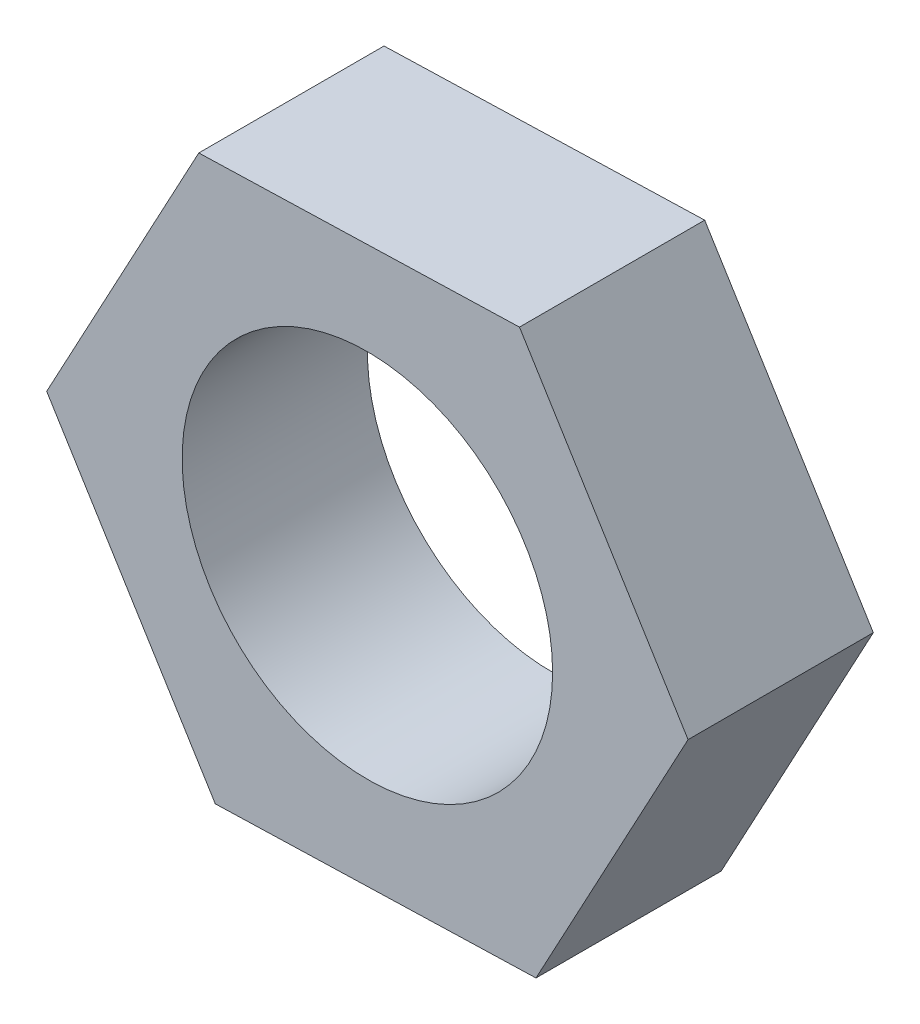
ISO-10303-21;
HEADER;
FILE_DESCRIPTION(('STEP AP214'),'2;1');
FILE_NAME('part.step','',(''),(''),'','','');
FILE_SCHEMA(('AUTOMOTIVE_DESIGN { 1 0 10303 214 1 1 1 1 }'));
ENDSEC;
DATA;
#1=APPLICATION_CONTEXT('core data for automotive mechanical design processes');
#2=APPLICATION_PROTOCOL_DEFINITION('international standard','automotive_design',2000,#1);
#3=PRODUCT_CONTEXT('',#1,'mechanical');
#4=PRODUCT('Part','Part','',(#3));
#5=PRODUCT_RELATED_PRODUCT_CATEGORY('part','',(#4));
#6=PRODUCT_DEFINITION_FORMATION('','',#4);
#7=PRODUCT_DEFINITION_CONTEXT('part definition',#1,'design');
#8=PRODUCT_DEFINITION('design','',#6,#7);
#9=PRODUCT_DEFINITION_SHAPE('','',#8);
#10=(LENGTH_UNIT() NAMED_UNIT(*) SI_UNIT(.MILLI.,.METRE.));
#11=(NAMED_UNIT(*) PLANE_ANGLE_UNIT() SI_UNIT($,.RADIAN.));
#12=(NAMED_UNIT(*) SI_UNIT($,.STERADIAN.) SOLID_ANGLE_UNIT());
#13=UNCERTAINTY_MEASURE_WITH_UNIT(LENGTH_MEASURE(1.E-05),#10,'distance_accuracy_value','');
#14=(GEOMETRIC_REPRESENTATION_CONTEXT(3) GLOBAL_UNCERTAINTY_ASSIGNED_CONTEXT((#13)) GLOBAL_UNIT_ASSIGNED_CONTEXT((#10,
#11,#12)) REPRESENTATION_CONTEXT('',''));
#15=CARTESIAN_POINT('',(0.,0.,0.));
#16=DIRECTION('',(0.,0.,1.));
#17=DIRECTION('',(1.,0.,0.));
#18=AXIS2_PLACEMENT_3D('',#15,#16,#17);
#19=CARTESIAN_POINT('',(0.,0.,5.));
#20=DIRECTION('',(0.,0.,1.));
#21=DIRECTION('',(1.,0.,0.));
#22=AXIS2_PLACEMENT_3D('',#19,#20,#21);
#23=PLANE('',#22);
#24=DIRECTION('',(0.999559119563031,0.0296911855334074,0.));
#25=VECTOR('',#24,1.);
#26=CARTESIAN_POINT('',(-4.1055340591294,-7.62526000142477,5.));
#27=LINE('',#26,#25);
#28=CARTESIAN_POINT('',(-4.1055340591294,-7.62526000142477,5.));
#29=VERTEX_POINT('',#28);
#30=CARTESIAN_POINT('',(4.55090184213052,-7.36812679202069,5.));
#31=VERTEX_POINT('',#30);
#32=EDGE_CURVE('E129',#29,#31,#27,.T.);
#33=ORIENTED_EDGE('',*,*,#32,.T.);
#34=DIRECTION('',(0.474066238841107,0.880489182892695,0.));
#35=VECTOR('',#34,1.);
#36=CARTESIAN_POINT('',(4.55090184213052,-7.36812679202069,5.));
#37=LINE('',#36,#35);
#38=CARTESIAN_POINT('',(8.65643590125991,0.257133209404077,5.));
#39=VERTEX_POINT('',#38);
#40=EDGE_CURVE('E87',#31,#39,#37,.T.);
#41=ORIENTED_EDGE('',*,*,#40,.T.);
#42=DIRECTION('',(-0.525492880721923,0.850797997359288,0.));
#43=VECTOR('',#42,1.);
#44=CARTESIAN_POINT('',(8.65643590125991,0.257133209404077,5.));
#45=LINE('',#44,#43);
#46=CARTESIAN_POINT('',(4.1055340591294,7.62526000142477,5.));
#47=VERTEX_POINT('',#46);
#48=EDGE_CURVE('E100',#39,#47,#45,.T.);
#49=ORIENTED_EDGE('',*,*,#48,.T.);
#50=DIRECTION('',(-0.999559119563031,-0.0296911855334073,0.));
#51=VECTOR('',#50,1.);
#52=CARTESIAN_POINT('',(4.1055340591294,7.62526000142477,5.));
#53=LINE('',#52,#51);
#54=CARTESIAN_POINT('',(-4.55090184213051,7.36812679202069,5.));
#55=VERTEX_POINT('',#54);
#56=EDGE_CURVE('E94',#47,#55,#53,.T.);
#57=ORIENTED_EDGE('',*,*,#56,.T.);
#58=DIRECTION('',(-0.474066238841108,-0.880489182892695,0.));
#59=VECTOR('',#58,1.);
#60=CARTESIAN_POINT('',(-4.55090184213051,7.36812679202069,5.));
#61=LINE('',#60,#59);
#62=CARTESIAN_POINT('',(-8.65643590125991,-0.257133209404078,5.));
#63=VERTEX_POINT('',#62);
#64=EDGE_CURVE('E98',#55,#63,#61,.T.);
#65=ORIENTED_EDGE('',*,*,#64,.T.);
#66=DIRECTION('',(0.525492880721923,-0.850797997359288,0.));
#67=VECTOR('',#66,1.);
#68=CARTESIAN_POINT('',(-8.65643590125991,-0.257133209404078,5.));
#69=LINE('',#68,#67);
#70=EDGE_CURVE('E50',#63,#29,#69,.T.);
#71=ORIENTED_EDGE('',*,*,#70,.T.);
#72=EDGE_LOOP('',(#33,#41,#49,#57,#65,#71));
#73=FACE_BOUND('',#72,.T.);
#74=CARTESIAN_POINT('',(0.,0.,5.));
#75=DIRECTION('',(0.,0.,1.));
#76=DIRECTION('',(1.,0.,0.));
#77=AXIS2_PLACEMENT_3D('',#74,#75,#76);
#78=CIRCLE('',#77,5.);
#79=CARTESIAN_POINT('',(5.,0.,5.));
#80=VERTEX_POINT('',#79);
#81=EDGE_CURVE('E122',#80,#80,#78,.T.);
#82=ORIENTED_EDGE('',*,*,#81,.F.);
#83=EDGE_LOOP('',(#82));
#84=FACE_BOUND('',#83,.T.);
#85=ADVANCED_FACE('F33',(#73,#84),#23,.T.);
#86=CARTESIAN_POINT('',(0.,0.,0.));
#87=DIRECTION('',(0.,0.,1.));
#88=DIRECTION('',(1.,0.,0.));
#89=AXIS2_PLACEMENT_3D('',#86,#87,#88);
#90=PLANE('',#89);
#91=DIRECTION('',(0.999559119563031,0.0296911855334074,0.));
#92=VECTOR('',#91,1.);
#93=CARTESIAN_POINT('',(-4.1055340591294,-7.62526000142477,0.));
#94=LINE('',#93,#92);
#95=CARTESIAN_POINT('',(-4.1055340591294,-7.62526000142477,0.));
#96=VERTEX_POINT('',#95);
#97=CARTESIAN_POINT('',(4.55090184213052,-7.36812679202069,0.));
#98=VERTEX_POINT('',#97);
#99=EDGE_CURVE('E118',#96,#98,#94,.T.);
#100=ORIENTED_EDGE('',*,*,#99,.F.);
#101=DIRECTION('',(0.525492880721923,-0.850797997359288,0.));
#102=VECTOR('',#101,1.);
#103=CARTESIAN_POINT('',(-8.65643590125991,-0.257133209404078,0.));
#104=LINE('',#103,#102);
#105=CARTESIAN_POINT('',(-8.65643590125991,-0.257133209404078,0.));
#106=VERTEX_POINT('',#105);
#107=EDGE_CURVE('E79',#106,#96,#104,.T.);
#108=ORIENTED_EDGE('',*,*,#107,.F.);
#109=DIRECTION('',(-0.474066238841108,-0.880489182892695,0.));
#110=VECTOR('',#109,1.);
#111=CARTESIAN_POINT('',(-4.55090184213051,7.36812679202069,0.));
#112=LINE('',#111,#110);
#113=CARTESIAN_POINT('',(-4.55090184213051,7.36812679202069,0.));
#114=VERTEX_POINT('',#113);
#115=EDGE_CURVE('E73',#114,#106,#112,.T.);
#116=ORIENTED_EDGE('',*,*,#115,.F.);
#117=DIRECTION('',(-0.999559119563031,-0.0296911855334073,0.));
#118=VECTOR('',#117,1.);
#119=CARTESIAN_POINT('',(4.1055340591294,7.62526000142477,0.));
#120=LINE('',#119,#118);
#121=CARTESIAN_POINT('',(4.1055340591294,7.62526000142477,0.));
#122=VERTEX_POINT('',#121);
#123=EDGE_CURVE('E108',#122,#114,#120,.T.);
#124=ORIENTED_EDGE('',*,*,#123,.F.);
#125=DIRECTION('',(-0.525492880721923,0.850797997359288,0.));
#126=VECTOR('',#125,1.);
#127=CARTESIAN_POINT('',(8.65643590125991,0.257133209404077,0.));
#128=LINE('',#127,#126);
#129=CARTESIAN_POINT('',(8.65643590125991,0.257133209404077,0.));
#130=VERTEX_POINT('',#129);
#131=EDGE_CURVE('E124',#130,#122,#128,.T.);
#132=ORIENTED_EDGE('',*,*,#131,.F.);
#133=DIRECTION('',(0.474066238841107,0.880489182892695,0.));
#134=VECTOR('',#133,1.);
#135=CARTESIAN_POINT('',(4.55090184213052,-7.36812679202069,0.));
#136=LINE('',#135,#134);
#137=EDGE_CURVE('E121',#98,#130,#136,.T.);
#138=ORIENTED_EDGE('',*,*,#137,.F.);
#139=EDGE_LOOP('',(#100,#108,#116,#124,#132,#138));
#140=FACE_BOUND('',#139,.T.);
#141=CARTESIAN_POINT('',(0.,0.,0.));
#142=DIRECTION('',(0.,0.,1.));
#143=DIRECTION('',(1.,0.,0.));
#144=AXIS2_PLACEMENT_3D('',#141,#142,#143);
#145=CIRCLE('',#144,5.);
#146=CARTESIAN_POINT('',(5.,0.,0.));
#147=VERTEX_POINT('',#146);
#148=EDGE_CURVE('E222',#147,#147,#145,.T.);
#149=ORIENTED_EDGE('',*,*,#148,.T.);
#150=EDGE_LOOP('',(#149));
#151=FACE_BOUND('',#150,.T.);
#152=ADVANCED_FACE('F138',(#140,#151),#90,.F.);
#153=CARTESIAN_POINT('',(-4.1055340591294,-7.62526000142477,5.));
#154=DIRECTION('',(-0.0296911855334074,0.999559119563031,0.));
#155=DIRECTION('',(-0.999559119563031,-0.0296911855334074,0.));
#156=AXIS2_PLACEMENT_3D('',#153,#154,#155);
#157=PLANE('',#156);
#158=ORIENTED_EDGE('',*,*,#99,.T.);
#159=DIRECTION('',(0.,0.,-1.));
#160=VECTOR('',#159,1.);
#161=CARTESIAN_POINT('',(4.55090184213052,-7.36812679202069,5.));
#162=LINE('',#161,#160);
#163=EDGE_CURVE('E11',#31,#98,#162,.T.);
#164=ORIENTED_EDGE('',*,*,#163,.F.);
#165=ORIENTED_EDGE('',*,*,#32,.F.);
#166=DIRECTION('',(0.,0.,-1.));
#167=VECTOR('',#166,1.);
#168=CARTESIAN_POINT('',(-4.1055340591294,-7.62526000142477,5.));
#169=LINE('',#168,#167);
#170=EDGE_CURVE('E114',#29,#96,#169,.T.);
#171=ORIENTED_EDGE('',*,*,#170,.T.);
#172=EDGE_LOOP('',(#158,#164,#165,#171));
#173=FACE_BOUND('',#172,.T.);
#174=ADVANCED_FACE('F35',(#173),#157,.F.);
#175=CARTESIAN_POINT('',(4.55090184213052,-7.36812679202069,5.));
#176=DIRECTION('',(-0.880489182892695,0.474066238841107,0.));
#177=DIRECTION('',(-0.474066238841107,-0.880489182892695,0.));
#178=AXIS2_PLACEMENT_3D('',#175,#176,#177);
#179=PLANE('',#178);
#180=ORIENTED_EDGE('',*,*,#137,.T.);
#181=DIRECTION('',(0.,0.,-1.));
#182=VECTOR('',#181,1.);
#183=CARTESIAN_POINT('',(8.65643590125991,0.257133209404077,5.));
#184=LINE('',#183,#182);
#185=EDGE_CURVE('E42',#39,#130,#184,.T.);
#186=ORIENTED_EDGE('',*,*,#185,.F.);
#187=ORIENTED_EDGE('',*,*,#40,.F.);
#188=ORIENTED_EDGE('',*,*,#163,.T.);
#189=EDGE_LOOP('',(#180,#186,#187,#188));
#190=FACE_BOUND('',#189,.T.);
#191=ADVANCED_FACE('F163',(#190),#179,.F.);
#192=CARTESIAN_POINT('',(8.65643590125991,0.257133209404077,5.));
#193=DIRECTION('',(-0.850797997359288,-0.525492880721923,0.));
#194=DIRECTION('',(0.525492880721923,-0.850797997359288,0.));
#195=AXIS2_PLACEMENT_3D('',#192,#193,#194);
#196=PLANE('',#195);
#197=ORIENTED_EDGE('',*,*,#131,.T.);
#198=DIRECTION('',(0.,0.,-1.));
#199=VECTOR('',#198,1.);
#200=CARTESIAN_POINT('',(4.1055340591294,7.62526000142477,5.));
#201=LINE('',#200,#199);
#202=EDGE_CURVE('E109',#47,#122,#201,.T.);
#203=ORIENTED_EDGE('',*,*,#202,.F.);
#204=ORIENTED_EDGE('',*,*,#48,.F.);
#205=ORIENTED_EDGE('',*,*,#185,.T.);
#206=EDGE_LOOP('',(#197,#203,#204,#205));
#207=FACE_BOUND('',#206,.T.);
#208=ADVANCED_FACE('F135',(#207),#196,.F.);
#209=CARTESIAN_POINT('',(4.1055340591294,7.62526000142477,5.));
#210=DIRECTION('',(0.0296911855334073,-0.999559119563031,0.));
#211=DIRECTION('',(0.999559119563031,0.0296911855334073,0.));
#212=AXIS2_PLACEMENT_3D('',#209,#210,#211);
#213=PLANE('',#212);
#214=ORIENTED_EDGE('',*,*,#123,.T.);
#215=DIRECTION('',(0.,0.,-1.));
#216=VECTOR('',#215,1.);
#217=CARTESIAN_POINT('',(-4.55090184213051,7.36812679202069,5.));
#218=LINE('',#217,#216);
#219=EDGE_CURVE('E105',#55,#114,#218,.T.);
#220=ORIENTED_EDGE('',*,*,#219,.F.);
#221=ORIENTED_EDGE('',*,*,#56,.F.);
#222=ORIENTED_EDGE('',*,*,#202,.T.);
#223=EDGE_LOOP('',(#214,#220,#221,#222));
#224=FACE_BOUND('',#223,.T.);
#225=ADVANCED_FACE('F106',(#224),#213,.F.);
#226=CARTESIAN_POINT('',(-4.55090184213051,7.36812679202069,5.));
#227=DIRECTION('',(0.880489182892695,-0.474066238841108,0.));
#228=DIRECTION('',(0.474066238841108,0.880489182892695,0.));
#229=AXIS2_PLACEMENT_3D('',#226,#227,#228);
#230=PLANE('',#229);
#231=ORIENTED_EDGE('',*,*,#115,.T.);
#232=DIRECTION('',(0.,0.,-1.));
#233=VECTOR('',#232,1.);
#234=CARTESIAN_POINT('',(-8.65643590125991,-0.257133209404078,5.));
#235=LINE('',#234,#233);
#236=EDGE_CURVE('E110',#63,#106,#235,.T.);
#237=ORIENTED_EDGE('',*,*,#236,.F.);
#238=ORIENTED_EDGE('',*,*,#64,.F.);
#239=ORIENTED_EDGE('',*,*,#219,.T.);
#240=EDGE_LOOP('',(#231,#237,#238,#239));
#241=FACE_BOUND('',#240,.T.);
#242=ADVANCED_FACE('F112',(#241),#230,.F.);
#243=CARTESIAN_POINT('',(-8.65643590125991,-0.257133209404078,5.));
#244=DIRECTION('',(0.850797997359288,0.525492880721923,0.));
#245=DIRECTION('',(-0.525492880721923,0.850797997359288,0.));
#246=AXIS2_PLACEMENT_3D('',#243,#244,#245);
#247=PLANE('',#246);
#248=ORIENTED_EDGE('',*,*,#107,.T.);
#249=ORIENTED_EDGE('',*,*,#170,.F.);
#250=ORIENTED_EDGE('',*,*,#70,.F.);
#251=ORIENTED_EDGE('',*,*,#236,.T.);
#252=EDGE_LOOP('',(#248,#249,#250,#251));
#253=FACE_BOUND('',#252,.T.);
#254=ADVANCED_FACE('F143',(#253),#247,.F.);
#255=CARTESIAN_POINT('',(0.,0.,5.));
#256=DIRECTION('',(0.,0.,-1.));
#257=DIRECTION('',(-1.,0.,0.));
#258=AXIS2_PLACEMENT_3D('',#255,#256,#257);
#259=CYLINDRICAL_SURFACE('',#258,5.);
#260=ORIENTED_EDGE('',*,*,#81,.T.);
#261=EDGE_LOOP('',(#260));
#262=FACE_BOUND('',#261,.T.);
#263=ORIENTED_EDGE('',*,*,#148,.F.);
#264=EDGE_LOOP('',(#263));
#265=FACE_BOUND('',#264,.T.);
#266=ADVANCED_FACE('F145',(#262,#265),#259,.F.);
#267=CLOSED_SHELL('',(#85,#152,#174,#191,#208,#225,#242,#254,#266));
#268=MANIFOLD_SOLID_BREP('B2',#267);
#269=ADVANCED_BREP_SHAPE_REPRESENTATION('',(#18,#268),#14);
#270=SHAPE_DEFINITION_REPRESENTATION(#9,#269);
ENDSEC;
END-ISO-10303-21;
